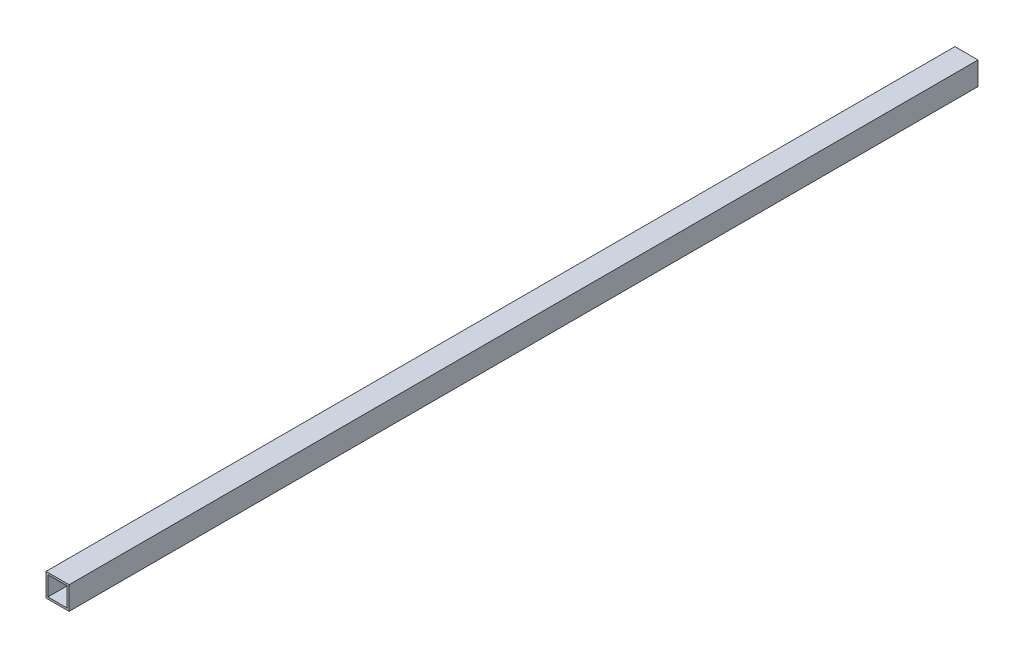
ISO-10303-21;
HEADER;
FILE_DESCRIPTION(('STEP AP214'),'2;1');
FILE_NAME('part.step','',(''),(''),'','','');
FILE_SCHEMA(('AUTOMOTIVE_DESIGN { 1 0 10303 214 1 1 1 1 }'));
ENDSEC;
DATA;
#1=APPLICATION_CONTEXT('core data for automotive mechanical design processes');
#2=APPLICATION_PROTOCOL_DEFINITION('international standard','automotive_design',2000,#1);
#3=PRODUCT_CONTEXT('',#1,'mechanical');
#4=PRODUCT('Part','Part','',(#3));
#5=PRODUCT_RELATED_PRODUCT_CATEGORY('part','',(#4));
#6=PRODUCT_DEFINITION_FORMATION('','',#4);
#7=PRODUCT_DEFINITION_CONTEXT('part definition',#1,'design');
#8=PRODUCT_DEFINITION('design','',#6,#7);
#9=PRODUCT_DEFINITION_SHAPE('','',#8);
#10=(LENGTH_UNIT() NAMED_UNIT(*) SI_UNIT(.MILLI.,.METRE.));
#11=(NAMED_UNIT(*) PLANE_ANGLE_UNIT() SI_UNIT($,.RADIAN.));
#12=(NAMED_UNIT(*) SI_UNIT($,.STERADIAN.) SOLID_ANGLE_UNIT());
#13=UNCERTAINTY_MEASURE_WITH_UNIT(LENGTH_MEASURE(1.E-05),#10,'distance_accuracy_value','');
#14=(GEOMETRIC_REPRESENTATION_CONTEXT(3) GLOBAL_UNCERTAINTY_ASSIGNED_CONTEXT((#13)) GLOBAL_UNIT_ASSIGNED_CONTEXT((#10,
#11,#12)) REPRESENTATION_CONTEXT('',''));
#15=CARTESIAN_POINT('',(0.,0.,0.));
#16=DIRECTION('',(0.,0.,1.));
#17=DIRECTION('',(1.,0.,0.));
#18=AXIS2_PLACEMENT_3D('',#15,#16,#17);
#19=CARTESIAN_POINT('',(0.,-15.875,609.6));
#20=DIRECTION('',(0.,-1.,0.));
#21=DIRECTION('',(1.,0.,0.));
#22=AXIS2_PLACEMENT_3D('',#19,#20,#21);
#23=PLANE('',#22);
#24=CARTESIAN_POINT('',(0.,-15.875,574.6));
#25=DIRECTION('',(0.,-1.,0.));
#26=DIRECTION('',(1.,0.,0.));
#27=AXIS2_PLACEMENT_3D('',#24,#25,#26);
#28=CIRCLE('',#27,4.5);
#29=CARTESIAN_POINT('',(4.50000000000005,-15.875,574.6));
#30=VERTEX_POINT('',#29);
#31=EDGE_CURVE('E131',#30,#30,#28,.T.);
#32=ORIENTED_EDGE('',*,*,#31,.T.);
#33=EDGE_LOOP('',(#32));
#34=FACE_BOUND('',#33,.T.);
#35=CARTESIAN_POINT('',(0.,-15.875,539.6));
#36=DIRECTION('',(0.,-1.,0.));
#37=DIRECTION('',(1.,0.,0.));
#38=AXIS2_PLACEMENT_3D('',#35,#36,#37);
#39=CIRCLE('',#38,4.5);
#40=CARTESIAN_POINT('',(4.50000000000006,-15.875,539.6));
#41=VERTEX_POINT('',#40);
#42=EDGE_CURVE('E136',#41,#41,#39,.T.);
#43=ORIENTED_EDGE('',*,*,#42,.T.);
#44=EDGE_LOOP('',(#43));
#45=FACE_BOUND('',#44,.T.);
#46=CARTESIAN_POINT('',(0.,-15.875,504.6));
#47=DIRECTION('',(0.,-1.,0.));
#48=DIRECTION('',(1.,0.,0.));
#49=AXIS2_PLACEMENT_3D('',#46,#47,#48);
#50=CIRCLE('',#49,4.5);
#51=CARTESIAN_POINT('',(4.50000000000006,-15.875,504.6));
#52=VERTEX_POINT('',#51);
#53=EDGE_CURVE('E196',#52,#52,#50,.T.);
#54=ORIENTED_EDGE('',*,*,#53,.T.);
#55=EDGE_LOOP('',(#54));
#56=FACE_BOUND('',#55,.T.);
#57=CARTESIAN_POINT('',(0.,-15.875,469.6));
#58=DIRECTION('',(0.,-1.,0.));
#59=DIRECTION('',(1.,0.,0.));
#60=AXIS2_PLACEMENT_3D('',#57,#58,#59);
#61=CIRCLE('',#60,4.5);
#62=CARTESIAN_POINT('',(4.50000000000006,-15.875,469.6));
#63=VERTEX_POINT('',#62);
#64=EDGE_CURVE('E188',#63,#63,#61,.T.);
#65=ORIENTED_EDGE('',*,*,#64,.T.);
#66=EDGE_LOOP('',(#65));
#67=FACE_BOUND('',#66,.T.);
#68=DIRECTION('',(-1.,0.,0.));
#69=VECTOR('',#68,1.);
#70=CARTESIAN_POINT('',(0.,-15.875,-890.4));
#71=LINE('',#70,#69);
#72=CARTESIAN_POINT('',(15.875,-15.875,-890.4));
#73=VERTEX_POINT('',#72);
#74=CARTESIAN_POINT('',(-15.875,-15.875,-890.4));
#75=VERTEX_POINT('',#74);
#76=EDGE_CURVE('E124',#73,#75,#71,.T.);
#77=ORIENTED_EDGE('',*,*,#76,.T.);
#78=DIRECTION('',(0.,0.,1.));
#79=VECTOR('',#78,1.);
#80=CARTESIAN_POINT('',(-15.875,-15.875,609.6));
#81=LINE('',#80,#79);
#82=CARTESIAN_POINT('',(-15.875,-15.875,609.6));
#83=VERTEX_POINT('',#82);
#84=EDGE_CURVE('E113',#75,#83,#81,.T.);
#85=ORIENTED_EDGE('',*,*,#84,.T.);
#86=DIRECTION('',(-1.,0.,0.));
#87=VECTOR('',#86,1.);
#88=CARTESIAN_POINT('',(0.,-15.875,609.6));
#89=LINE('',#88,#87);
#90=CARTESIAN_POINT('',(15.875,-15.875,609.6));
#91=VERTEX_POINT('',#90);
#92=EDGE_CURVE('E122',#91,#83,#89,.T.);
#93=ORIENTED_EDGE('',*,*,#92,.F.);
#94=DIRECTION('',(0.,0.,-1.));
#95=VECTOR('',#94,1.);
#96=CARTESIAN_POINT('',(15.875,-15.875,609.6));
#97=LINE('',#96,#95);
#98=EDGE_CURVE('E148',#91,#73,#97,.T.);
#99=ORIENTED_EDGE('',*,*,#98,.T.);
#100=EDGE_LOOP('',(#77,#85,#93,#99));
#101=FACE_BOUND('',#100,.T.);
#102=ADVANCED_FACE('F47',(#34,#45,#56,#67,#101),#23,.F.);
#103=CARTESIAN_POINT('',(0.,-19.05,609.6));
#104=DIRECTION('',(0.,1.,0.));
#105=DIRECTION('',(0.,0.,1.));
#106=AXIS2_PLACEMENT_3D('',#103,#104,#105);
#107=PLANE('',#106);
#108=CARTESIAN_POINT('',(0.,-19.05,574.6));
#109=DIRECTION('',(0.,-1.,0.));
#110=DIRECTION('',(0.,0.,-1.));
#111=AXIS2_PLACEMENT_3D('',#108,#109,#110);
#112=CIRCLE('',#111,4.5);
#113=CARTESIAN_POINT('',(0.,-19.05,570.1));
#114=VERTEX_POINT('',#113);
#115=EDGE_CURVE('E185',#114,#114,#112,.T.);
#116=ORIENTED_EDGE('',*,*,#115,.F.);
#117=EDGE_LOOP('',(#116));
#118=FACE_BOUND('',#117,.T.);
#119=CARTESIAN_POINT('',(0.,-19.05,539.6));
#120=DIRECTION('',(0.,-1.,0.));
#121=DIRECTION('',(0.,0.,-1.));
#122=AXIS2_PLACEMENT_3D('',#119,#120,#121);
#123=CIRCLE('',#122,4.5);
#124=CARTESIAN_POINT('',(0.,-19.05,535.1));
#125=VERTEX_POINT('',#124);
#126=EDGE_CURVE('E189',#125,#125,#123,.T.);
#127=ORIENTED_EDGE('',*,*,#126,.F.);
#128=EDGE_LOOP('',(#127));
#129=FACE_BOUND('',#128,.T.);
#130=CARTESIAN_POINT('',(0.,-19.05,504.6));
#131=DIRECTION('',(0.,-1.,0.));
#132=DIRECTION('',(0.,0.,-1.));
#133=AXIS2_PLACEMENT_3D('',#130,#131,#132);
#134=CIRCLE('',#133,4.5);
#135=CARTESIAN_POINT('',(0.,-19.05,500.1));
#136=VERTEX_POINT('',#135);
#137=EDGE_CURVE('E181',#136,#136,#134,.T.);
#138=ORIENTED_EDGE('',*,*,#137,.F.);
#139=EDGE_LOOP('',(#138));
#140=FACE_BOUND('',#139,.T.);
#141=CARTESIAN_POINT('',(0.,-19.05,469.6));
#142=DIRECTION('',(0.,-1.,0.));
#143=DIRECTION('',(0.,0.,-1.));
#144=AXIS2_PLACEMENT_3D('',#141,#142,#143);
#145=CIRCLE('',#144,4.5);
#146=CARTESIAN_POINT('',(0.,-19.05,465.1));
#147=VERTEX_POINT('',#146);
#148=EDGE_CURVE('E178',#147,#147,#145,.T.);
#149=ORIENTED_EDGE('',*,*,#148,.F.);
#150=EDGE_LOOP('',(#149));
#151=FACE_BOUND('',#150,.T.);
#152=DIRECTION('',(0.,0.,-1.));
#153=VECTOR('',#152,1.);
#154=CARTESIAN_POINT('',(19.05,-19.05,609.6));
#155=LINE('',#154,#153);
#156=CARTESIAN_POINT('',(19.05,-19.05,609.6));
#157=VERTEX_POINT('',#156);
#158=CARTESIAN_POINT('',(19.05,-19.05,-890.4));
#159=VERTEX_POINT('',#158);
#160=EDGE_CURVE('E54',#157,#159,#155,.T.);
#161=ORIENTED_EDGE('',*,*,#160,.F.);
#162=DIRECTION('',(1.,0.,0.));
#163=VECTOR('',#162,1.);
#164=CARTESIAN_POINT('',(0.,-19.05,609.6));
#165=LINE('',#164,#163);
#166=CARTESIAN_POINT('',(-19.05,-19.05,609.6));
#167=VERTEX_POINT('',#166);
#168=EDGE_CURVE('E133',#167,#157,#165,.T.);
#169=ORIENTED_EDGE('',*,*,#168,.F.);
#170=DIRECTION('',(0.,0.,-1.));
#171=VECTOR('',#170,1.);
#172=CARTESIAN_POINT('',(-19.05,-19.05,609.6));
#173=LINE('',#172,#171);
#174=CARTESIAN_POINT('',(-19.05,-19.05,-890.4));
#175=VERTEX_POINT('',#174);
#176=EDGE_CURVE('E11',#167,#175,#173,.T.);
#177=ORIENTED_EDGE('',*,*,#176,.T.);
#178=DIRECTION('',(-1.,0.,0.));
#179=VECTOR('',#178,1.);
#180=CARTESIAN_POINT('',(0.,-19.05,-890.4));
#181=LINE('',#180,#179);
#182=EDGE_CURVE('E172',#159,#175,#181,.T.);
#183=ORIENTED_EDGE('',*,*,#182,.F.);
#184=EDGE_LOOP('',(#161,#169,#177,#183));
#185=FACE_BOUND('',#184,.T.);
#186=ADVANCED_FACE('F176',(#118,#129,#140,#151,#185),#107,.F.);
#187=CARTESIAN_POINT('',(19.05,0.,609.6));
#188=DIRECTION('',(1.,0.,0.));
#189=DIRECTION('',(0.,1.,0.));
#190=AXIS2_PLACEMENT_3D('',#187,#188,#189);
#191=PLANE('',#190);
#192=ORIENTED_EDGE('',*,*,#160,.T.);
#193=DIRECTION('',(0.,-1.,0.));
#194=VECTOR('',#193,1.);
#195=CARTESIAN_POINT('',(19.05,0.,-890.4));
#196=LINE('',#195,#194);
#197=CARTESIAN_POINT('',(19.05,19.05,-890.4));
#198=VERTEX_POINT('',#197);
#199=EDGE_CURVE('E162',#198,#159,#196,.T.);
#200=ORIENTED_EDGE('',*,*,#199,.F.);
#201=DIRECTION('',(0.,0.,-1.));
#202=VECTOR('',#201,1.);
#203=CARTESIAN_POINT('',(19.05,19.05,609.6));
#204=LINE('',#203,#202);
#205=CARTESIAN_POINT('',(19.05,19.05,609.6));
#206=VERTEX_POINT('',#205);
#207=EDGE_CURVE('E154',#206,#198,#204,.T.);
#208=ORIENTED_EDGE('',*,*,#207,.F.);
#209=DIRECTION('',(0.,-1.,0.));
#210=VECTOR('',#209,1.);
#211=CARTESIAN_POINT('',(19.05,0.,609.6));
#212=LINE('',#211,#210);
#213=EDGE_CURVE('E141',#206,#157,#212,.T.);
#214=ORIENTED_EDGE('',*,*,#213,.T.);
#215=EDGE_LOOP('',(#192,#200,#208,#214));
#216=FACE_BOUND('',#215,.T.);
#217=ADVANCED_FACE('F160',(#216),#191,.T.);
#218=CARTESIAN_POINT('',(0.,19.05,609.6));
#219=DIRECTION('',(0.,1.,0.));
#220=DIRECTION('',(0.,0.,1.));
#221=AXIS2_PLACEMENT_3D('',#218,#219,#220);
#222=PLANE('',#221);
#223=ORIENTED_EDGE('',*,*,#207,.T.);
#224=DIRECTION('',(1.,0.,0.));
#225=VECTOR('',#224,1.);
#226=CARTESIAN_POINT('',(0.,19.05,-890.4));
#227=LINE('',#226,#225);
#228=CARTESIAN_POINT('',(-19.05,19.05,-890.4));
#229=VERTEX_POINT('',#228);
#230=EDGE_CURVE('E174',#229,#198,#227,.T.);
#231=ORIENTED_EDGE('',*,*,#230,.F.);
#232=DIRECTION('',(0.,0.,-1.));
#233=VECTOR('',#232,1.);
#234=CARTESIAN_POINT('',(-19.05,19.05,609.6));
#235=LINE('',#234,#233);
#236=CARTESIAN_POINT('',(-19.05,19.05,609.6));
#237=VERTEX_POINT('',#236);
#238=EDGE_CURVE('E152',#237,#229,#235,.T.);
#239=ORIENTED_EDGE('',*,*,#238,.F.);
#240=DIRECTION('',(1.,0.,0.));
#241=VECTOR('',#240,1.);
#242=CARTESIAN_POINT('',(0.,19.05,609.6));
#243=LINE('',#242,#241);
#244=EDGE_CURVE('E144',#237,#206,#243,.T.);
#245=ORIENTED_EDGE('',*,*,#244,.T.);
#246=EDGE_LOOP('',(#223,#231,#239,#245));
#247=FACE_BOUND('',#246,.T.);
#248=ADVANCED_FACE('F231',(#247),#222,.T.);
#249=CARTESIAN_POINT('',(-19.05,0.,609.6));
#250=DIRECTION('',(1.,0.,0.));
#251=DIRECTION('',(0.,0.,-1.));
#252=AXIS2_PLACEMENT_3D('',#249,#250,#251);
#253=PLANE('',#252);
#254=ORIENTED_EDGE('',*,*,#238,.T.);
#255=DIRECTION('',(0.,1.,0.));
#256=VECTOR('',#255,1.);
#257=CARTESIAN_POINT('',(-19.05,0.,-890.4));
#258=LINE('',#257,#256);
#259=EDGE_CURVE('E454',#175,#229,#258,.T.);
#260=ORIENTED_EDGE('',*,*,#259,.F.);
#261=ORIENTED_EDGE('',*,*,#176,.F.);
#262=DIRECTION('',(0.,-1.,0.));
#263=VECTOR('',#262,1.);
#264=CARTESIAN_POINT('',(-19.05,0.,609.6));
#265=LINE('',#264,#263);
#266=EDGE_CURVE('E130',#237,#167,#265,.T.);
#267=ORIENTED_EDGE('',*,*,#266,.F.);
#268=EDGE_LOOP('',(#254,#260,#261,#267));
#269=FACE_BOUND('',#268,.T.);
#270=ADVANCED_FACE('F237',(#269),#253,.F.);
#271=CARTESIAN_POINT('',(0.,15.875,609.6));
#272=DIRECTION('',(0.,-1.,0.));
#273=DIRECTION('',(0.,0.,-1.));
#274=AXIS2_PLACEMENT_3D('',#271,#272,#273);
#275=PLANE('',#274);
#276=DIRECTION('',(0.,0.,1.));
#277=VECTOR('',#276,1.);
#278=CARTESIAN_POINT('',(-15.875,15.875,609.6));
#279=LINE('',#278,#277);
#280=CARTESIAN_POINT('',(-15.875,15.875,-890.4));
#281=VERTEX_POINT('',#280);
#282=CARTESIAN_POINT('',(-15.875,15.875,609.6));
#283=VERTEX_POINT('',#282);
#284=EDGE_CURVE('E65',#281,#283,#279,.T.);
#285=ORIENTED_EDGE('',*,*,#284,.F.);
#286=DIRECTION('',(-1.,0.,0.));
#287=VECTOR('',#286,1.);
#288=CARTESIAN_POINT('',(0.,15.875,-890.4));
#289=LINE('',#288,#287);
#290=CARTESIAN_POINT('',(15.875,15.875,-890.4));
#291=VERTEX_POINT('',#290);
#292=EDGE_CURVE('E455',#291,#281,#289,.T.);
#293=ORIENTED_EDGE('',*,*,#292,.F.);
#294=DIRECTION('',(0.,0.,-1.));
#295=VECTOR('',#294,1.);
#296=CARTESIAN_POINT('',(15.875,15.875,609.6));
#297=LINE('',#296,#295);
#298=CARTESIAN_POINT('',(15.875,15.875,609.6));
#299=VERTEX_POINT('',#298);
#300=EDGE_CURVE('E150',#299,#291,#297,.T.);
#301=ORIENTED_EDGE('',*,*,#300,.F.);
#302=DIRECTION('',(-1.,0.,0.));
#303=VECTOR('',#302,1.);
#304=CARTESIAN_POINT('',(0.,15.875,609.6));
#305=LINE('',#304,#303);
#306=EDGE_CURVE('E61',#299,#283,#305,.T.);
#307=ORIENTED_EDGE('',*,*,#306,.T.);
#308=EDGE_LOOP('',(#285,#293,#301,#307));
#309=FACE_BOUND('',#308,.T.);
#310=ADVANCED_FACE('F241',(#309),#275,.T.);
#311=CARTESIAN_POINT('',(15.875,0.,609.6));
#312=DIRECTION('',(1.,0.,0.));
#313=DIRECTION('',(0.,1.,0.));
#314=AXIS2_PLACEMENT_3D('',#311,#312,#313);
#315=PLANE('',#314);
#316=ORIENTED_EDGE('',*,*,#300,.T.);
#317=DIRECTION('',(0.,1.,0.));
#318=VECTOR('',#317,1.);
#319=CARTESIAN_POINT('',(15.875,0.,-890.4));
#320=LINE('',#319,#318);
#321=EDGE_CURVE('E457',#73,#291,#320,.T.);
#322=ORIENTED_EDGE('',*,*,#321,.F.);
#323=ORIENTED_EDGE('',*,*,#98,.F.);
#324=DIRECTION('',(0.,-1.,0.));
#325=VECTOR('',#324,1.);
#326=CARTESIAN_POINT('',(15.875,0.,609.6));
#327=LINE('',#326,#325);
#328=EDGE_CURVE('E128',#299,#91,#327,.T.);
#329=ORIENTED_EDGE('',*,*,#328,.F.);
#330=EDGE_LOOP('',(#316,#322,#323,#329));
#331=FACE_BOUND('',#330,.T.);
#332=ADVANCED_FACE('F245',(#331),#315,.F.);
#333=CARTESIAN_POINT('',(0.,0.,609.6));
#334=DIRECTION('',(0.,0.,1.));
#335=DIRECTION('',(1.,0.,0.));
#336=AXIS2_PLACEMENT_3D('',#333,#334,#335);
#337=PLANE('',#336);
#338=ORIENTED_EDGE('',*,*,#244,.F.);
#339=ORIENTED_EDGE('',*,*,#266,.T.);
#340=ORIENTED_EDGE('',*,*,#168,.T.);
#341=ORIENTED_EDGE('',*,*,#213,.F.);
#342=EDGE_LOOP('',(#338,#339,#340,#341));
#343=FACE_BOUND('',#342,.T.);
#344=ORIENTED_EDGE('',*,*,#92,.T.);
#345=DIRECTION('',(0.,1.,0.));
#346=VECTOR('',#345,1.);
#347=CARTESIAN_POINT('',(-15.875,19.05,609.6));
#348=LINE('',#347,#346);
#349=EDGE_CURVE('E109',#83,#283,#348,.T.);
#350=ORIENTED_EDGE('',*,*,#349,.T.);
#351=ORIENTED_EDGE('',*,*,#306,.F.);
#352=ORIENTED_EDGE('',*,*,#328,.T.);
#353=EDGE_LOOP('',(#344,#350,#351,#352));
#354=FACE_BOUND('',#353,.T.);
#355=ADVANCED_FACE('F126',(#343,#354),#337,.T.);
#356=CARTESIAN_POINT('',(0.,-9.05,469.6));
#357=DIRECTION('',(0.,-1.,0.));
#358=DIRECTION('',(0.,0.,-1.));
#359=AXIS2_PLACEMENT_3D('',#356,#357,#358);
#360=CYLINDRICAL_SURFACE('',#359,4.5);
#361=ORIENTED_EDGE('',*,*,#148,.T.);
#362=EDGE_LOOP('',(#361));
#363=FACE_BOUND('',#362,.T.);
#364=ORIENTED_EDGE('',*,*,#64,.F.);
#365=EDGE_LOOP('',(#364));
#366=FACE_BOUND('',#365,.T.);
#367=ADVANCED_FACE('F215',(#363,#366),#360,.F.);
#368=CARTESIAN_POINT('',(0.,-9.05,504.6));
#369=DIRECTION('',(0.,-1.,0.));
#370=DIRECTION('',(0.,0.,-1.));
#371=AXIS2_PLACEMENT_3D('',#368,#369,#370);
#372=CYLINDRICAL_SURFACE('',#371,4.5);
#373=ORIENTED_EDGE('',*,*,#137,.T.);
#374=EDGE_LOOP('',(#373));
#375=FACE_BOUND('',#374,.T.);
#376=ORIENTED_EDGE('',*,*,#53,.F.);
#377=EDGE_LOOP('',(#376));
#378=FACE_BOUND('',#377,.T.);
#379=ADVANCED_FACE('F206',(#375,#378),#372,.F.);
#380=CARTESIAN_POINT('',(0.,-9.05,539.6));
#381=DIRECTION('',(0.,-1.,0.));
#382=DIRECTION('',(0.,0.,-1.));
#383=AXIS2_PLACEMENT_3D('',#380,#381,#382);
#384=CYLINDRICAL_SURFACE('',#383,4.5);
#385=ORIENTED_EDGE('',*,*,#126,.T.);
#386=EDGE_LOOP('',(#385));
#387=FACE_BOUND('',#386,.T.);
#388=ORIENTED_EDGE('',*,*,#42,.F.);
#389=EDGE_LOOP('',(#388));
#390=FACE_BOUND('',#389,.T.);
#391=ADVANCED_FACE('F203',(#387,#390),#384,.F.);
#392=CARTESIAN_POINT('',(0.,-9.05,574.6));
#393=DIRECTION('',(0.,-1.,0.));
#394=DIRECTION('',(0.,0.,-1.));
#395=AXIS2_PLACEMENT_3D('',#392,#393,#394);
#396=CYLINDRICAL_SURFACE('',#395,4.5);
#397=ORIENTED_EDGE('',*,*,#115,.T.);
#398=EDGE_LOOP('',(#397));
#399=FACE_BOUND('',#398,.T.);
#400=ORIENTED_EDGE('',*,*,#31,.F.);
#401=EDGE_LOOP('',(#400));
#402=FACE_BOUND('',#401,.T.);
#403=ADVANCED_FACE('F205',(#399,#402),#396,.F.);
#404=CARTESIAN_POINT('',(0.,0.,-890.4));
#405=DIRECTION('',(0.,0.,-1.));
#406=DIRECTION('',(-1.,0.,0.));
#407=AXIS2_PLACEMENT_3D('',#404,#405,#406);
#408=PLANE('',#407);
#409=ORIENTED_EDGE('',*,*,#182,.T.);
#410=ORIENTED_EDGE('',*,*,#259,.T.);
#411=ORIENTED_EDGE('',*,*,#230,.T.);
#412=ORIENTED_EDGE('',*,*,#199,.T.);
#413=EDGE_LOOP('',(#409,#410,#411,#412));
#414=FACE_BOUND('',#413,.T.);
#415=ORIENTED_EDGE('',*,*,#292,.T.);
#416=DIRECTION('',(0.,1.,0.));
#417=VECTOR('',#416,1.);
#418=CARTESIAN_POINT('',(-15.875,19.05,-890.4));
#419=LINE('',#418,#417);
#420=EDGE_CURVE('E117',#75,#281,#419,.T.);
#421=ORIENTED_EDGE('',*,*,#420,.F.);
#422=ORIENTED_EDGE('',*,*,#76,.F.);
#423=ORIENTED_EDGE('',*,*,#321,.T.);
#424=EDGE_LOOP('',(#415,#421,#422,#423));
#425=FACE_BOUND('',#424,.T.);
#426=ADVANCED_FACE('F169',(#414,#425),#408,.T.);
#427=CARTESIAN_POINT('',(-15.875,19.05,-890.4));
#428=DIRECTION('',(1.,0.,0.));
#429=DIRECTION('',(0.,1.,0.));
#430=AXIS2_PLACEMENT_3D('',#427,#428,#429);
#431=PLANE('',#430);
#432=ORIENTED_EDGE('',*,*,#84,.F.);
#433=ORIENTED_EDGE('',*,*,#420,.T.);
#434=ORIENTED_EDGE('',*,*,#284,.T.);
#435=ORIENTED_EDGE('',*,*,#349,.F.);
#436=EDGE_LOOP('',(#432,#433,#434,#435));
#437=FACE_BOUND('',#436,.T.);
#438=ADVANCED_FACE('F111',(#437),#431,.T.);
#439=CLOSED_SHELL('',(#102,#186,#217,#248,#270,#310,#332,#355,#367,#379,#391,#403,#426,#438));
#440=MANIFOLD_SOLID_BREP('B2',#439);
#441=ADVANCED_BREP_SHAPE_REPRESENTATION('',(#18,#440),#14);
#442=SHAPE_DEFINITION_REPRESENTATION(#9,#441);
ENDSEC;
END-ISO-10303-21;
